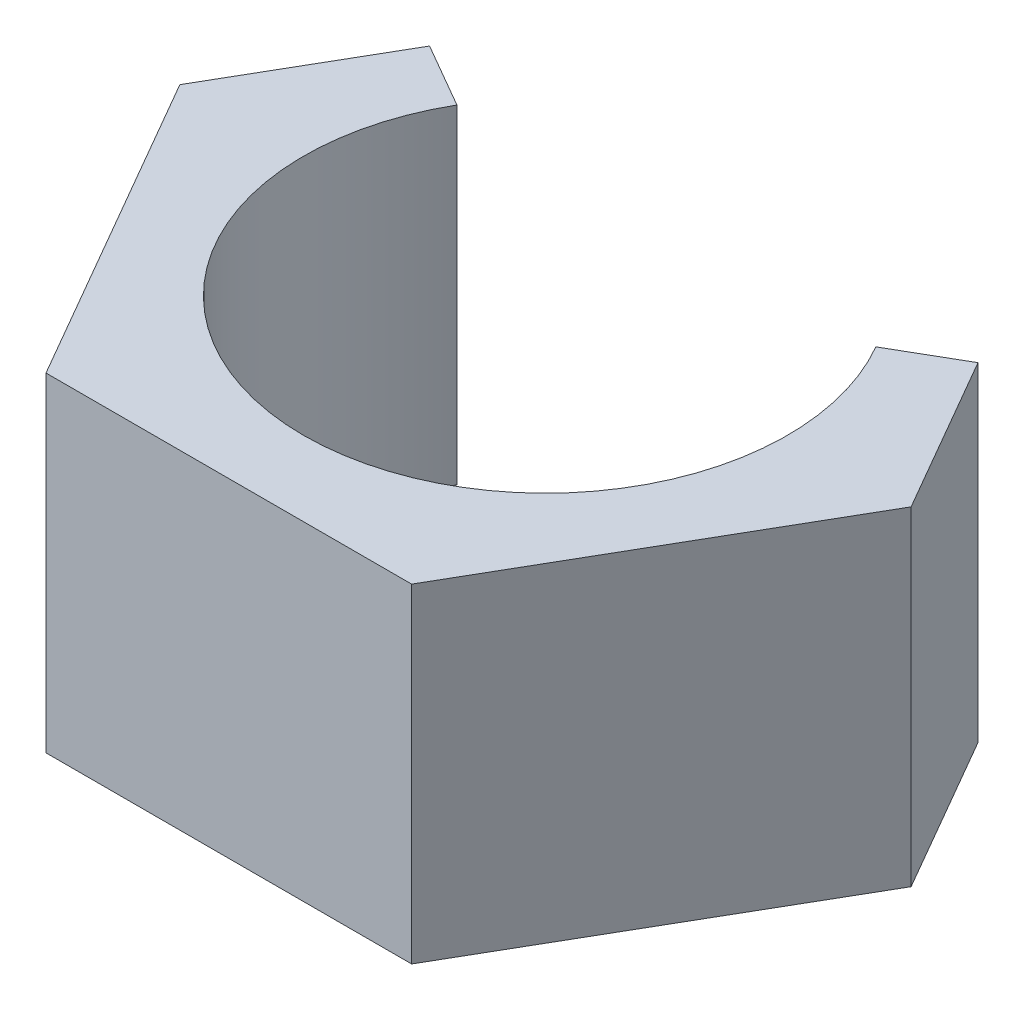
ISO-10303-21;
HEADER;
FILE_DESCRIPTION(('STEP AP214'),'2;1');
FILE_NAME('part.step','',(''),(''),'','','');
FILE_SCHEMA(('AUTOMOTIVE_DESIGN { 1 0 10303 214 1 1 1 1 }'));
ENDSEC;
DATA;
#1=APPLICATION_CONTEXT('core data for automotive mechanical design processes');
#2=APPLICATION_PROTOCOL_DEFINITION('international standard','automotive_design',2000,#1);
#3=PRODUCT_CONTEXT('',#1,'mechanical');
#4=PRODUCT('Part','Part','',(#3));
#5=PRODUCT_RELATED_PRODUCT_CATEGORY('part','',(#4));
#6=PRODUCT_DEFINITION_FORMATION('','',#4);
#7=PRODUCT_DEFINITION_CONTEXT('part definition',#1,'design');
#8=PRODUCT_DEFINITION('design','',#6,#7);
#9=PRODUCT_DEFINITION_SHAPE('','',#8);
#10=(LENGTH_UNIT() NAMED_UNIT(*) SI_UNIT(.MILLI.,.METRE.));
#11=(NAMED_UNIT(*) PLANE_ANGLE_UNIT() SI_UNIT($,.RADIAN.));
#12=(NAMED_UNIT(*) SI_UNIT($,.STERADIAN.) SOLID_ANGLE_UNIT());
#13=UNCERTAINTY_MEASURE_WITH_UNIT(LENGTH_MEASURE(1.E-05),#10,'distance_accuracy_value','');
#14=(GEOMETRIC_REPRESENTATION_CONTEXT(3) GLOBAL_UNCERTAINTY_ASSIGNED_CONTEXT((#13)) GLOBAL_UNIT_ASSIGNED_CONTEXT((#10,
#11,#12)) REPRESENTATION_CONTEXT('',''));
#15=CARTESIAN_POINT('',(0.,0.,0.));
#16=DIRECTION('',(0.,0.,1.));
#17=DIRECTION('',(1.,0.,0.));
#18=AXIS2_PLACEMENT_3D('',#15,#16,#17);
#19=CARTESIAN_POINT('',(0.,-2.,21.175));
#20=DIRECTION('',(0.,0.,1.));
#21=DIRECTION('',(1.,0.,0.));
#22=AXIS2_PLACEMENT_3D('',#19,#20,#21);
#23=PLANE('',#22);
#24=DIRECTION('',(0.,1.,0.));
#25=VECTOR('',#24,1.);
#26=CARTESIAN_POINT('',(12.2253919500903,-2.,21.175));
#27=LINE('',#26,#25);
#28=CARTESIAN_POINT('',(12.2253919500903,-2.,21.175));
#29=VERTEX_POINT('',#28);
#30=CARTESIAN_POINT('',(12.2253919500903,20.,21.175));
#31=VERTEX_POINT('',#30);
#32=EDGE_CURVE('E42',#29,#31,#27,.T.);
#33=ORIENTED_EDGE('',*,*,#32,.T.);
#34=DIRECTION('',(1.,0.,0.));
#35=VECTOR('',#34,1.);
#36=CARTESIAN_POINT('',(0.,20.,21.175));
#37=LINE('',#36,#35);
#38=CARTESIAN_POINT('',(-12.2253919500903,20.,21.175));
#39=VERTEX_POINT('',#38);
#40=EDGE_CURVE('E149',#39,#31,#37,.T.);
#41=ORIENTED_EDGE('',*,*,#40,.F.);
#42=DIRECTION('',(0.,1.,0.));
#43=VECTOR('',#42,1.);
#44=CARTESIAN_POINT('',(-12.2253919500903,-2.,21.175));
#45=LINE('',#44,#43);
#46=CARTESIAN_POINT('',(-12.2253919500903,-2.,21.175));
#47=VERTEX_POINT('',#46);
#48=EDGE_CURVE('E11',#47,#39,#45,.T.);
#49=ORIENTED_EDGE('',*,*,#48,.F.);
#50=DIRECTION('',(1.,0.,0.));
#51=VECTOR('',#50,1.);
#52=CARTESIAN_POINT('',(0.,-2.,21.175));
#53=LINE('',#52,#51);
#54=EDGE_CURVE('E150',#47,#29,#53,.T.);
#55=ORIENTED_EDGE('',*,*,#54,.T.);
#56=EDGE_LOOP('',(#33,#41,#49,#55));
#57=FACE_BOUND('',#56,.T.);
#58=ADVANCED_FACE('F39',(#57),#23,.T.);
#59=CARTESIAN_POINT('',(-18.3380879251355,-2.,10.5875));
#60=DIRECTION('',(-0.866025403784438,0.,0.5));
#61=DIRECTION('',(0.5,0.,0.866025403784438));
#62=AXIS2_PLACEMENT_3D('',#59,#60,#61);
#63=PLANE('',#62);
#64=ORIENTED_EDGE('',*,*,#48,.T.);
#65=DIRECTION('',(0.5,0.,0.866025403784438));
#66=VECTOR('',#65,1.);
#67=CARTESIAN_POINT('',(-18.3380879251355,20.,10.5875));
#68=LINE('',#67,#66);
#69=CARTESIAN_POINT('',(-24.4507839001807,20.,0.));
#70=VERTEX_POINT('',#69);
#71=EDGE_CURVE('E164',#70,#39,#68,.T.);
#72=ORIENTED_EDGE('',*,*,#71,.F.);
#73=DIRECTION('',(0.,1.,0.));
#74=VECTOR('',#73,1.);
#75=CARTESIAN_POINT('',(-24.4507839001807,-2.,0.));
#76=LINE('',#75,#74);
#77=CARTESIAN_POINT('',(-24.4507839001807,-2.,0.));
#78=VERTEX_POINT('',#77);
#79=EDGE_CURVE('E48',#78,#70,#76,.T.);
#80=ORIENTED_EDGE('',*,*,#79,.F.);
#81=DIRECTION('',(0.5,0.,0.866025403784438));
#82=VECTOR('',#81,1.);
#83=CARTESIAN_POINT('',(-18.3380879251355,-2.,10.5875));
#84=LINE('',#83,#82);
#85=EDGE_CURVE('E128',#78,#47,#84,.T.);
#86=ORIENTED_EDGE('',*,*,#85,.T.);
#87=EDGE_LOOP('',(#64,#72,#80,#86));
#88=FACE_BOUND('',#87,.T.);
#89=ADVANCED_FACE('F208',(#88),#63,.T.);
#90=CARTESIAN_POINT('',(-18.3380879251355,-2.,-10.5875));
#91=DIRECTION('',(-0.866025403784439,0.,-0.499999999999999));
#92=DIRECTION('',(-0.5,0.,0.866025403784439));
#93=AXIS2_PLACEMENT_3D('',#90,#91,#92);
#94=PLANE('',#93);
#95=DIRECTION('',(0.,1.,0.));
#96=VECTOR('',#95,1.);
#97=CARTESIAN_POINT('',(-18.3380879251355,-2.,-10.5875));
#98=LINE('',#97,#96);
#99=CARTESIAN_POINT('',(-18.3380879251355,-2.,-10.5875));
#100=VERTEX_POINT('',#99);
#101=CARTESIAN_POINT('',(-18.3380879251355,20.,-10.5875));
#102=VERTEX_POINT('',#101);
#103=EDGE_CURVE('E108',#100,#102,#98,.T.);
#104=ORIENTED_EDGE('',*,*,#103,.F.);
#105=DIRECTION('',(-0.5,0.,0.866025403784439));
#106=VECTOR('',#105,1.);
#107=CARTESIAN_POINT('',(-18.3380879251355,-2.,-10.5875));
#108=LINE('',#107,#106);
#109=EDGE_CURVE('E62',#100,#78,#108,.T.);
#110=ORIENTED_EDGE('',*,*,#109,.T.);
#111=ORIENTED_EDGE('',*,*,#79,.T.);
#112=DIRECTION('',(-0.5,0.,0.866025403784439));
#113=VECTOR('',#112,1.);
#114=CARTESIAN_POINT('',(-18.3380879251355,20.,-10.5875));
#115=LINE('',#114,#113);
#116=EDGE_CURVE('E121',#102,#70,#115,.T.);
#117=ORIENTED_EDGE('',*,*,#116,.F.);
#118=EDGE_LOOP('',(#104,#110,#111,#117));
#119=FACE_BOUND('',#118,.T.);
#120=ADVANCED_FACE('F120',(#119),#94,.T.);
#121=CARTESIAN_POINT('',(18.3380879251355,-2.,-10.5875));
#122=DIRECTION('',(0.866025403784438,0.,-0.5));
#123=DIRECTION('',(-0.5,0.,-0.866025403784438));
#124=AXIS2_PLACEMENT_3D('',#121,#122,#123);
#125=PLANE('',#124);
#126=DIRECTION('',(0.,1.,0.));
#127=VECTOR('',#126,1.);
#128=CARTESIAN_POINT('',(18.3380879251355,-2.,-10.5875));
#129=LINE('',#128,#127);
#130=CARTESIAN_POINT('',(18.3380879251355,-2.,-10.5875));
#131=VERTEX_POINT('',#130);
#132=CARTESIAN_POINT('',(18.3380879251355,20.,-10.5875));
#133=VERTEX_POINT('',#132);
#134=EDGE_CURVE('E170',#131,#133,#129,.T.);
#135=ORIENTED_EDGE('',*,*,#134,.T.);
#136=DIRECTION('',(-0.5,0.,-0.866025403784438));
#137=VECTOR('',#136,1.);
#138=CARTESIAN_POINT('',(18.3380879251355,20.,-10.5875));
#139=LINE('',#138,#137);
#140=CARTESIAN_POINT('',(24.4507839001807,20.,0.));
#141=VERTEX_POINT('',#140);
#142=EDGE_CURVE('E158',#141,#133,#139,.T.);
#143=ORIENTED_EDGE('',*,*,#142,.F.);
#144=DIRECTION('',(0.,1.,0.));
#145=VECTOR('',#144,1.);
#146=CARTESIAN_POINT('',(24.4507839001807,-2.,0.));
#147=LINE('',#146,#145);
#148=CARTESIAN_POINT('',(24.4507839001807,-2.,0.));
#149=VERTEX_POINT('',#148);
#150=EDGE_CURVE('E141',#149,#141,#147,.T.);
#151=ORIENTED_EDGE('',*,*,#150,.F.);
#152=DIRECTION('',(-0.5,0.,-0.866025403784438));
#153=VECTOR('',#152,1.);
#154=CARTESIAN_POINT('',(18.3380879251355,-2.,-10.5875));
#155=LINE('',#154,#153);
#156=EDGE_CURVE('E130',#149,#131,#155,.T.);
#157=ORIENTED_EDGE('',*,*,#156,.T.);
#158=EDGE_LOOP('',(#135,#143,#151,#157));
#159=FACE_BOUND('',#158,.T.);
#160=ADVANCED_FACE('F186',(#159),#125,.T.);
#161=CARTESIAN_POINT('',(18.3380879251355,-2.,10.5875));
#162=DIRECTION('',(0.866025403784439,0.,0.499999999999999));
#163=DIRECTION('',(0.499999999999999,0.,-0.866025403784439));
#164=AXIS2_PLACEMENT_3D('',#161,#162,#163);
#165=PLANE('',#164);
#166=ORIENTED_EDGE('',*,*,#150,.T.);
#167=DIRECTION('',(0.499999999999999,0.,-0.866025403784439));
#168=VECTOR('',#167,1.);
#169=CARTESIAN_POINT('',(18.3380879251355,20.,10.5875));
#170=LINE('',#169,#168);
#171=EDGE_CURVE('E152',#31,#141,#170,.T.);
#172=ORIENTED_EDGE('',*,*,#171,.F.);
#173=ORIENTED_EDGE('',*,*,#32,.F.);
#174=DIRECTION('',(0.499999999999999,0.,-0.866025403784439));
#175=VECTOR('',#174,1.);
#176=CARTESIAN_POINT('',(18.3380879251355,-2.,10.5875));
#177=LINE('',#176,#175);
#178=EDGE_CURVE('E136',#29,#149,#177,.T.);
#179=ORIENTED_EDGE('',*,*,#178,.T.);
#180=EDGE_LOOP('',(#166,#172,#173,#179));
#181=FACE_BOUND('',#180,.T.);
#182=ADVANCED_FACE('F153',(#181),#165,.T.);
#183=CARTESIAN_POINT('',(0.,-2.,0.));
#184=DIRECTION('',(0.,1.,0.));
#185=DIRECTION('',(0.,0.,1.));
#186=AXIS2_PLACEMENT_3D('',#183,#184,#185);
#187=PLANE('',#186);
#188=CARTESIAN_POINT('',(0.,-2.,0.));
#189=DIRECTION('',(0.,1.,0.));
#190=DIRECTION('',(0.,0.,1.));
#191=AXIS2_PLACEMENT_3D('',#188,#189,#190);
#192=CIRCLE('',#191,16.175);
#193=CARTESIAN_POINT('',(-14.0079609062133,-2.,-8.08749999999999));
#194=VERTEX_POINT('',#193);
#195=CARTESIAN_POINT('',(14.0079609062133,-2.,-8.08750000000001));
#196=VERTEX_POINT('',#195);
#197=EDGE_CURVE('E116',#194,#196,#192,.T.);
#198=ORIENTED_EDGE('',*,*,#197,.T.);
#199=DIRECTION('',(0.866025403784438,0.,-0.500000000000001));
#200=VECTOR('',#199,1.);
#201=CARTESIAN_POINT('',(18.3380879251355,-2.,-10.5875));
#202=LINE('',#201,#200);
#203=EDGE_CURVE('E123',#196,#131,#202,.T.);
#204=ORIENTED_EDGE('',*,*,#203,.T.);
#205=ORIENTED_EDGE('',*,*,#156,.F.);
#206=ORIENTED_EDGE('',*,*,#178,.F.);
#207=ORIENTED_EDGE('',*,*,#54,.F.);
#208=ORIENTED_EDGE('',*,*,#85,.F.);
#209=ORIENTED_EDGE('',*,*,#109,.F.);
#210=DIRECTION('',(0.866025403784439,0.,0.5));
#211=VECTOR('',#210,1.);
#212=CARTESIAN_POINT('',(-18.3380879251355,-2.,-10.5875));
#213=LINE('',#212,#211);
#214=EDGE_CURVE('E106',#100,#194,#213,.T.);
#215=ORIENTED_EDGE('',*,*,#214,.T.);
#216=EDGE_LOOP('',(#198,#204,#205,#206,#207,#208,#209,#215));
#217=FACE_BOUND('',#216,.T.);
#218=ADVANCED_FACE('F126',(#217),#187,.F.);
#219=CARTESIAN_POINT('',(0.,20.,0.));
#220=DIRECTION('',(0.,-1.,0.));
#221=DIRECTION('',(0.,0.,-1.));
#222=AXIS2_PLACEMENT_3D('',#219,#220,#221);
#223=CYLINDRICAL_SURFACE('',#222,16.175);
#224=DIRECTION('',(0.,1.,0.));
#225=VECTOR('',#224,1.);
#226=CARTESIAN_POINT('',(14.0079609062133,-2.,-8.08750000000001));
#227=LINE('',#226,#225);
#228=CARTESIAN_POINT('',(14.0079609062133,20.,-8.08750000000001));
#229=VERTEX_POINT('',#228);
#230=EDGE_CURVE('E194',#196,#229,#227,.T.);
#231=ORIENTED_EDGE('',*,*,#230,.F.);
#232=ORIENTED_EDGE('',*,*,#197,.F.);
#233=DIRECTION('',(0.,1.,0.));
#234=VECTOR('',#233,1.);
#235=CARTESIAN_POINT('',(-14.0079609062133,-2.,-8.08749999999999));
#236=LINE('',#235,#234);
#237=CARTESIAN_POINT('',(-14.0079609062133,20.,-8.08749999999999));
#238=VERTEX_POINT('',#237);
#239=EDGE_CURVE('E111',#194,#238,#236,.T.);
#240=ORIENTED_EDGE('',*,*,#239,.T.);
#241=CARTESIAN_POINT('',(0.,20.,0.));
#242=DIRECTION('',(0.,1.,0.));
#243=DIRECTION('',(0.,0.,1.));
#244=AXIS2_PLACEMENT_3D('',#241,#242,#243);
#245=CIRCLE('',#244,16.175);
#246=EDGE_CURVE('E166',#238,#229,#245,.T.);
#247=ORIENTED_EDGE('',*,*,#246,.T.);
#248=EDGE_LOOP('',(#231,#232,#240,#247));
#249=FACE_BOUND('',#248,.T.);
#250=ADVANCED_FACE('F193',(#249),#223,.F.);
#251=CARTESIAN_POINT('',(0.,20.,0.));
#252=DIRECTION('',(0.,1.,0.));
#253=DIRECTION('',(0.,0.,1.));
#254=AXIS2_PLACEMENT_3D('',#251,#252,#253);
#255=PLANE('',#254);
#256=DIRECTION('',(0.866025403784438,0.,-0.500000000000001));
#257=VECTOR('',#256,1.);
#258=CARTESIAN_POINT('',(18.3380879251355,20.,-10.5875));
#259=LINE('',#258,#257);
#260=EDGE_CURVE('E117',#229,#133,#259,.T.);
#261=ORIENTED_EDGE('',*,*,#260,.F.);
#262=ORIENTED_EDGE('',*,*,#246,.F.);
#263=DIRECTION('',(0.866025403784439,0.,0.5));
#264=VECTOR('',#263,1.);
#265=CARTESIAN_POINT('',(-18.3380879251355,20.,-10.5875));
#266=LINE('',#265,#264);
#267=EDGE_CURVE('E190',#102,#238,#266,.T.);
#268=ORIENTED_EDGE('',*,*,#267,.F.);
#269=ORIENTED_EDGE('',*,*,#116,.T.);
#270=ORIENTED_EDGE('',*,*,#71,.T.);
#271=ORIENTED_EDGE('',*,*,#40,.T.);
#272=ORIENTED_EDGE('',*,*,#171,.T.);
#273=ORIENTED_EDGE('',*,*,#142,.T.);
#274=EDGE_LOOP('',(#261,#262,#268,#269,#270,#271,#272,#273));
#275=FACE_BOUND('',#274,.T.);
#276=ADVANCED_FACE('F162',(#275),#255,.T.);
#277=CARTESIAN_POINT('',(18.3380879251355,-2.,-10.5875));
#278=DIRECTION('',(0.500000000000001,0.,0.866025403784438));
#279=DIRECTION('',(0.866025403784438,0.,-0.500000000000001));
#280=AXIS2_PLACEMENT_3D('',#277,#278,#279);
#281=PLANE('',#280);
#282=ORIENTED_EDGE('',*,*,#230,.T.);
#283=ORIENTED_EDGE('',*,*,#260,.T.);
#284=ORIENTED_EDGE('',*,*,#134,.F.);
#285=ORIENTED_EDGE('',*,*,#203,.F.);
#286=EDGE_LOOP('',(#282,#283,#284,#285));
#287=FACE_BOUND('',#286,.T.);
#288=ADVANCED_FACE('F230',(#287),#281,.F.);
#289=CARTESIAN_POINT('',(-18.3380879251355,-2.,-10.5875));
#290=DIRECTION('',(-0.5,0.,0.866025403784439));
#291=DIRECTION('',(0.866025403784439,0.,0.5));
#292=AXIS2_PLACEMENT_3D('',#289,#290,#291);
#293=PLANE('',#292);
#294=ORIENTED_EDGE('',*,*,#103,.T.);
#295=ORIENTED_EDGE('',*,*,#267,.T.);
#296=ORIENTED_EDGE('',*,*,#239,.F.);
#297=ORIENTED_EDGE('',*,*,#214,.F.);
#298=EDGE_LOOP('',(#294,#295,#296,#297));
#299=FACE_BOUND('',#298,.T.);
#300=ADVANCED_FACE('F107',(#299),#293,.F.);
#301=CLOSED_SHELL('',(#58,#89,#120,#160,#182,#218,#250,#276,#288,#300));
#302=MANIFOLD_SOLID_BREP('B2',#301);
#303=ADVANCED_BREP_SHAPE_REPRESENTATION('',(#18,#302),#14);
#304=SHAPE_DEFINITION_REPRESENTATION(#9,#303);
ENDSEC;
END-ISO-10303-21;
